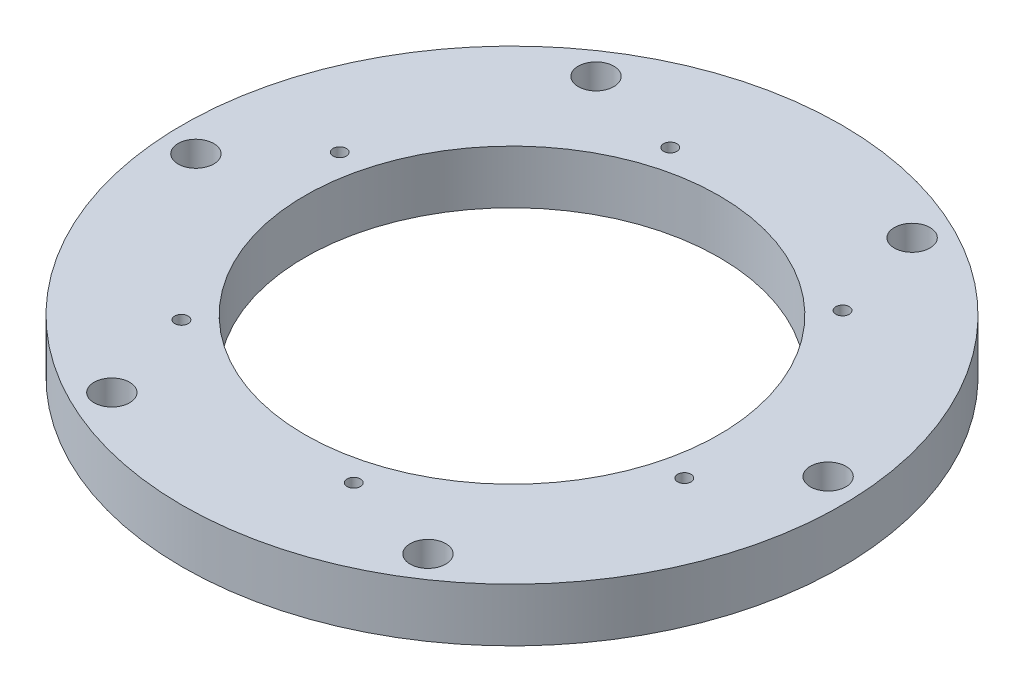
ISO-10303-21;
HEADER;
FILE_DESCRIPTION(('STEP AP214'),'2;1');
FILE_NAME('part.step','',(''),(''),'','','');
FILE_SCHEMA(('AUTOMOTIVE_DESIGN { 1 0 10303 214 1 1 1 1 }'));
ENDSEC;
DATA;
#1=APPLICATION_CONTEXT('core data for automotive mechanical design processes');
#2=APPLICATION_PROTOCOL_DEFINITION('international standard','automotive_design',2000,#1);
#3=PRODUCT_CONTEXT('',#1,'mechanical');
#4=PRODUCT('Part','Part','',(#3));
#5=PRODUCT_RELATED_PRODUCT_CATEGORY('part','',(#4));
#6=PRODUCT_DEFINITION_FORMATION('','',#4);
#7=PRODUCT_DEFINITION_CONTEXT('part definition',#1,'design');
#8=PRODUCT_DEFINITION('design','',#6,#7);
#9=PRODUCT_DEFINITION_SHAPE('','',#8);
#10=(LENGTH_UNIT() NAMED_UNIT(*) SI_UNIT(.MILLI.,.METRE.));
#11=(NAMED_UNIT(*) PLANE_ANGLE_UNIT() SI_UNIT($,.RADIAN.));
#12=(NAMED_UNIT(*) SI_UNIT($,.STERADIAN.) SOLID_ANGLE_UNIT());
#13=UNCERTAINTY_MEASURE_WITH_UNIT(LENGTH_MEASURE(1.E-05),#10,'distance_accuracy_value','');
#14=(GEOMETRIC_REPRESENTATION_CONTEXT(3) GLOBAL_UNCERTAINTY_ASSIGNED_CONTEXT((#13)) GLOBAL_UNIT_ASSIGNED_CONTEXT((#10,
#11,#12)) REPRESENTATION_CONTEXT('',''));
#15=CARTESIAN_POINT('',(0.,0.,0.));
#16=DIRECTION('',(0.,0.,1.));
#17=DIRECTION('',(1.,0.,0.));
#18=AXIS2_PLACEMENT_3D('',#15,#16,#17);
#19=CARTESIAN_POINT('',(0.,12.,0.));
#20=DIRECTION('',(0.,1.,0.));
#21=DIRECTION('',(0.,0.,1.));
#22=AXIS2_PLACEMENT_3D('',#19,#20,#21);
#23=PLANE('',#22);
#24=CARTESIAN_POINT('',(-14.829977420968,12.,-50.3619079234818));
#25=DIRECTION('',(0.,1.,0.));
#26=DIRECTION('',(0.,0.,1.));
#27=AXIS2_PLACEMENT_3D('',#24,#25,#26);
#28=CIRCLE('',#27,1.50000000000354);
#29=CARTESIAN_POINT('',(-14.829977420968,12.,-48.8619079234782));
#30=VERTEX_POINT('',#29);
#31=EDGE_CURVE('E115',#30,#30,#28,.T.);
#32=ORIENTED_EDGE('',*,*,#31,.F.);
#33=EDGE_LOOP('',(#32));
#34=FACE_BOUND('',#33,.T.);
#35=CARTESIAN_POINT('',(-51.0296803552723,12.,-12.3378167776296));
#36=DIRECTION('',(0.,1.,0.));
#37=DIRECTION('',(0.,0.,1.));
#38=AXIS2_PLACEMENT_3D('',#35,#36,#37);
#39=CIRCLE('',#38,1.50000000000555);
#40=CARTESIAN_POINT('',(-51.0296803552723,12.,-10.8378167776241));
#41=VERTEX_POINT('',#40);
#42=EDGE_CURVE('E103',#41,#41,#39,.T.);
#43=ORIENTED_EDGE('',*,*,#42,.F.);
#44=EDGE_LOOP('',(#43));
#45=FACE_BOUND('',#44,.T.);
#46=CARTESIAN_POINT('',(-36.1997029343015,12.,38.024091145854));
#47=DIRECTION('',(0.,1.,0.));
#48=DIRECTION('',(0.,0.,1.));
#49=AXIS2_PLACEMENT_3D('',#46,#47,#48);
#50=CIRCLE('',#49,1.50000000000428);
#51=CARTESIAN_POINT('',(-36.1997029343015,12.,39.5240911458582));
#52=VERTEX_POINT('',#51);
#53=EDGE_CURVE('E91',#52,#52,#50,.T.);
#54=ORIENTED_EDGE('',*,*,#53,.F.);
#55=EDGE_LOOP('',(#54));
#56=FACE_BOUND('',#55,.T.);
#57=CARTESIAN_POINT('',(14.8299774209735,12.,50.3619079234855));
#58=DIRECTION('',(0.,1.,0.));
#59=DIRECTION('',(0.,0.,1.));
#60=AXIS2_PLACEMENT_3D('',#57,#58,#59);
#61=CIRCLE('',#60,1.500000000001);
#62=CARTESIAN_POINT('',(14.8299774209735,12.,51.8619079234865));
#63=VERTEX_POINT('',#62);
#64=EDGE_CURVE('E79',#63,#63,#61,.T.);
#65=ORIENTED_EDGE('',*,*,#64,.F.);
#66=EDGE_LOOP('',(#65));
#67=FACE_BOUND('',#66,.T.);
#68=CARTESIAN_POINT('',(51.0296803552777,12.,12.3378167776334));
#69=DIRECTION('',(0.,1.,0.));
#70=DIRECTION('',(0.,0.,1.));
#71=AXIS2_PLACEMENT_3D('',#68,#69,#70);
#72=CIRCLE('',#71,1.49999999999886);
#73=CARTESIAN_POINT('',(51.0296803552777,12.,13.8378167776322));
#74=VERTEX_POINT('',#73);
#75=EDGE_CURVE('E67',#74,#74,#72,.T.);
#76=ORIENTED_EDGE('',*,*,#75,.F.);
#77=EDGE_LOOP('',(#76));
#78=FACE_BOUND('',#77,.T.);
#79=CARTESIAN_POINT('',(36.199702934307,12.,-38.0240911458502));
#80=DIRECTION('',(0.,1.,0.));
#81=DIRECTION('',(0.,0.,1.));
#82=AXIS2_PLACEMENT_3D('',#79,#80,#81);
#83=CIRCLE('',#82,1.5);
#84=CARTESIAN_POINT('',(36.199702934307,12.,-36.5240911458502));
#85=VERTEX_POINT('',#84);
#86=EDGE_CURVE('E55',#85,#85,#83,.T.);
#87=ORIENTED_EDGE('',*,*,#86,.F.);
#88=EDGE_LOOP('',(#87));
#89=FACE_BOUND('',#88,.T.);
#90=CARTESIAN_POINT('',(0.,12.,0.));
#91=DIRECTION('',(0.,1.,0.));
#92=DIRECTION('',(0.,0.,1.));
#93=AXIS2_PLACEMENT_3D('',#90,#91,#92);
#94=CIRCLE('',#93,74.);
#95=CARTESIAN_POINT('',(0.,12.,74.));
#96=VERTEX_POINT('',#95);
#97=EDGE_CURVE('E10',#96,#96,#94,.T.);
#98=ORIENTED_EDGE('',*,*,#97,.T.);
#99=EDGE_LOOP('',(#98));
#100=FACE_BOUND('',#99,.T.);
#101=CARTESIAN_POINT('',(0.,12.,0.));
#102=DIRECTION('',(0.,1.,0.));
#103=DIRECTION('',(0.,0.,1.));
#104=AXIS2_PLACEMENT_3D('',#101,#102,#103);
#105=CIRCLE('',#104,46.5);
#106=CARTESIAN_POINT('',(0.,12.,46.5));
#107=VERTEX_POINT('',#106);
#108=EDGE_CURVE('E50',#107,#107,#105,.T.);
#109=ORIENTED_EDGE('',*,*,#108,.F.);
#110=EDGE_LOOP('',(#109));
#111=FACE_BOUND('',#110,.T.);
#112=CARTESIAN_POINT('',(29.8814160452311,12.,-59.9674993236487));
#113=DIRECTION('',(0.,1.,0.));
#114=DIRECTION('',(0.,0.,1.));
#115=AXIS2_PLACEMENT_3D('',#112,#113,#114);
#116=CIRCLE('',#115,4.00000000000001);
#117=CARTESIAN_POINT('',(29.8814160452311,12.,-55.9674993236487));
#118=VERTEX_POINT('',#117);
#119=EDGE_CURVE('E61',#118,#118,#116,.T.);
#120=ORIENTED_EDGE('',*,*,#119,.F.);
#121=EDGE_LOOP('',(#120));
#122=FACE_BOUND('',#121,.T.);
#123=CARTESIAN_POINT('',(66.8740858383244,12.,-4.1056842656037));
#124=DIRECTION('',(0.,1.,0.));
#125=DIRECTION('',(0.,0.,1.));
#126=AXIS2_PLACEMENT_3D('',#123,#124,#125);
#127=CIRCLE('',#126,3.99999999999893);
#128=CARTESIAN_POINT('',(66.8740858383244,12.,-0.105684265604762));
#129=VERTEX_POINT('',#128);
#130=EDGE_CURVE('E73',#129,#129,#127,.T.);
#131=ORIENTED_EDGE('',*,*,#130,.F.);
#132=EDGE_LOOP('',(#131));
#133=FACE_BOUND('',#132,.T.);
#134=CARTESIAN_POINT('',(36.992669793096,12.,55.8618150580468));
#135=DIRECTION('',(0.,1.,0.));
#136=DIRECTION('',(0.,0.,1.));
#137=AXIS2_PLACEMENT_3D('',#134,#135,#136);
#138=CIRCLE('',#137,4.00000000000111);
#139=CARTESIAN_POINT('',(36.992669793096,12.,59.861815058048));
#140=VERTEX_POINT('',#139);
#141=EDGE_CURVE('E85',#140,#140,#138,.T.);
#142=ORIENTED_EDGE('',*,*,#141,.F.);
#143=EDGE_LOOP('',(#142));
#144=FACE_BOUND('',#143,.T.);
#145=CARTESIAN_POINT('',(-29.8814160452257,12.,59.9674993236524));
#146=DIRECTION('',(0.,1.,0.));
#147=DIRECTION('',(0.,0.,1.));
#148=AXIS2_PLACEMENT_3D('',#145,#146,#147);
#149=CIRCLE('',#148,4.00000000000445);
#150=CARTESIAN_POINT('',(-29.8814160452257,12.,63.9674993236568));
#151=VERTEX_POINT('',#150);
#152=EDGE_CURVE('E97',#151,#151,#149,.T.);
#153=ORIENTED_EDGE('',*,*,#152,.F.);
#154=EDGE_LOOP('',(#153));
#155=FACE_BOUND('',#154,.T.);
#156=CARTESIAN_POINT('',(-66.874085838319,12.,4.10568426560743));
#157=DIRECTION('',(0.,1.,0.));
#158=DIRECTION('',(0.,0.,1.));
#159=AXIS2_PLACEMENT_3D('',#156,#157,#158);
#160=CIRCLE('',#159,4.00000000000578);
#161=CARTESIAN_POINT('',(-66.874085838319,12.,8.1056842656132));
#162=VERTEX_POINT('',#161);
#163=EDGE_CURVE('E109',#162,#162,#160,.T.);
#164=ORIENTED_EDGE('',*,*,#163,.F.);
#165=EDGE_LOOP('',(#164));
#166=FACE_BOUND('',#165,.T.);
#167=CARTESIAN_POINT('',(-36.9926697930906,12.,-55.8618150580431));
#168=DIRECTION('',(0.,1.,0.));
#169=DIRECTION('',(0.,0.,1.));
#170=AXIS2_PLACEMENT_3D('',#167,#168,#169);
#171=CIRCLE('',#170,4.00000000000381);
#172=CARTESIAN_POINT('',(-36.9926697930906,12.,-51.8618150580393));
#173=VERTEX_POINT('',#172);
#174=EDGE_CURVE('E121',#173,#173,#171,.T.);
#175=ORIENTED_EDGE('',*,*,#174,.F.);
#176=EDGE_LOOP('',(#175));
#177=FACE_BOUND('',#176,.T.);
#178=ADVANCED_FACE('F39',(#34,#45,#56,#67,#78,#89,#100,#111,#122,#133,#144,#155,#166,#177),#23,.T.);
#179=CARTESIAN_POINT('',(0.,0.,0.));
#180=DIRECTION('',(0.,1.,0.));
#181=DIRECTION('',(0.,0.,1.));
#182=AXIS2_PLACEMENT_3D('',#179,#180,#181);
#183=PLANE('',#182);
#184=CARTESIAN_POINT('',(0.,0.,0.));
#185=DIRECTION('',(0.,1.,0.));
#186=DIRECTION('',(0.,0.,1.));
#187=AXIS2_PLACEMENT_3D('',#184,#185,#186);
#188=CIRCLE('',#187,74.);
#189=CARTESIAN_POINT('',(0.,0.,74.));
#190=VERTEX_POINT('',#189);
#191=EDGE_CURVE('E43',#190,#190,#188,.T.);
#192=ORIENTED_EDGE('',*,*,#191,.F.);
#193=EDGE_LOOP('',(#192));
#194=FACE_BOUND('',#193,.T.);
#195=CARTESIAN_POINT('',(0.,0.,0.));
#196=DIRECTION('',(0.,1.,0.));
#197=DIRECTION('',(0.,0.,1.));
#198=AXIS2_PLACEMENT_3D('',#195,#196,#197);
#199=CIRCLE('',#198,46.5);
#200=CARTESIAN_POINT('',(0.,0.,46.5));
#201=VERTEX_POINT('',#200);
#202=EDGE_CURVE('E52',#201,#201,#199,.T.);
#203=ORIENTED_EDGE('',*,*,#202,.T.);
#204=EDGE_LOOP('',(#203));
#205=FACE_BOUND('',#204,.T.);
#206=CARTESIAN_POINT('',(36.199702934307,0.,-38.0240911458502));
#207=DIRECTION('',(0.,1.,0.));
#208=DIRECTION('',(0.,0.,1.));
#209=AXIS2_PLACEMENT_3D('',#206,#207,#208);
#210=CIRCLE('',#209,1.5);
#211=CARTESIAN_POINT('',(36.199702934307,0.,-36.5240911458502));
#212=VERTEX_POINT('',#211);
#213=EDGE_CURVE('E58',#212,#212,#210,.T.);
#214=ORIENTED_EDGE('',*,*,#213,.T.);
#215=EDGE_LOOP('',(#214));
#216=FACE_BOUND('',#215,.T.);
#217=CARTESIAN_POINT('',(29.8814160452311,0.,-59.9674993236487));
#218=DIRECTION('',(0.,1.,0.));
#219=DIRECTION('',(0.,0.,1.));
#220=AXIS2_PLACEMENT_3D('',#217,#218,#219);
#221=CIRCLE('',#220,4.00000000000001);
#222=CARTESIAN_POINT('',(29.8814160452311,0.,-55.9674993236487));
#223=VERTEX_POINT('',#222);
#224=EDGE_CURVE('E64',#223,#223,#221,.T.);
#225=ORIENTED_EDGE('',*,*,#224,.T.);
#226=EDGE_LOOP('',(#225));
#227=FACE_BOUND('',#226,.T.);
#228=CARTESIAN_POINT('',(51.0296803552777,0.,12.3378167776334));
#229=DIRECTION('',(0.,1.,0.));
#230=DIRECTION('',(0.,0.,1.));
#231=AXIS2_PLACEMENT_3D('',#228,#229,#230);
#232=CIRCLE('',#231,1.49999999999886);
#233=CARTESIAN_POINT('',(51.0296803552777,0.,13.8378167776322));
#234=VERTEX_POINT('',#233);
#235=EDGE_CURVE('E70',#234,#234,#232,.T.);
#236=ORIENTED_EDGE('',*,*,#235,.T.);
#237=EDGE_LOOP('',(#236));
#238=FACE_BOUND('',#237,.T.);
#239=CARTESIAN_POINT('',(66.8740858383244,0.,-4.1056842656037));
#240=DIRECTION('',(0.,1.,0.));
#241=DIRECTION('',(0.,0.,1.));
#242=AXIS2_PLACEMENT_3D('',#239,#240,#241);
#243=CIRCLE('',#242,3.99999999999893);
#244=CARTESIAN_POINT('',(66.8740858383244,0.,-0.105684265604762));
#245=VERTEX_POINT('',#244);
#246=EDGE_CURVE('E76',#245,#245,#243,.T.);
#247=ORIENTED_EDGE('',*,*,#246,.T.);
#248=EDGE_LOOP('',(#247));
#249=FACE_BOUND('',#248,.T.);
#250=CARTESIAN_POINT('',(14.8299774209735,0.,50.3619079234855));
#251=DIRECTION('',(0.,1.,0.));
#252=DIRECTION('',(0.,0.,1.));
#253=AXIS2_PLACEMENT_3D('',#250,#251,#252);
#254=CIRCLE('',#253,1.500000000001);
#255=CARTESIAN_POINT('',(14.8299774209735,0.,51.8619079234865));
#256=VERTEX_POINT('',#255);
#257=EDGE_CURVE('E82',#256,#256,#254,.T.);
#258=ORIENTED_EDGE('',*,*,#257,.T.);
#259=EDGE_LOOP('',(#258));
#260=FACE_BOUND('',#259,.T.);
#261=CARTESIAN_POINT('',(36.992669793096,0.,55.8618150580468));
#262=DIRECTION('',(0.,1.,0.));
#263=DIRECTION('',(0.,0.,1.));
#264=AXIS2_PLACEMENT_3D('',#261,#262,#263);
#265=CIRCLE('',#264,4.00000000000111);
#266=CARTESIAN_POINT('',(36.992669793096,0.,59.861815058048));
#267=VERTEX_POINT('',#266);
#268=EDGE_CURVE('E88',#267,#267,#265,.T.);
#269=ORIENTED_EDGE('',*,*,#268,.T.);
#270=EDGE_LOOP('',(#269));
#271=FACE_BOUND('',#270,.T.);
#272=CARTESIAN_POINT('',(-36.1997029343015,0.,38.024091145854));
#273=DIRECTION('',(0.,1.,0.));
#274=DIRECTION('',(0.,0.,1.));
#275=AXIS2_PLACEMENT_3D('',#272,#273,#274);
#276=CIRCLE('',#275,1.50000000000428);
#277=CARTESIAN_POINT('',(-36.1997029343015,0.,39.5240911458582));
#278=VERTEX_POINT('',#277);
#279=EDGE_CURVE('E94',#278,#278,#276,.T.);
#280=ORIENTED_EDGE('',*,*,#279,.T.);
#281=EDGE_LOOP('',(#280));
#282=FACE_BOUND('',#281,.T.);
#283=CARTESIAN_POINT('',(-29.8814160452257,0.,59.9674993236524));
#284=DIRECTION('',(0.,1.,0.));
#285=DIRECTION('',(0.,0.,1.));
#286=AXIS2_PLACEMENT_3D('',#283,#284,#285);
#287=CIRCLE('',#286,4.00000000000445);
#288=CARTESIAN_POINT('',(-29.8814160452257,0.,63.9674993236568));
#289=VERTEX_POINT('',#288);
#290=EDGE_CURVE('E100',#289,#289,#287,.T.);
#291=ORIENTED_EDGE('',*,*,#290,.T.);
#292=EDGE_LOOP('',(#291));
#293=FACE_BOUND('',#292,.T.);
#294=CARTESIAN_POINT('',(-51.0296803552723,0.,-12.3378167776296));
#295=DIRECTION('',(0.,1.,0.));
#296=DIRECTION('',(0.,0.,1.));
#297=AXIS2_PLACEMENT_3D('',#294,#295,#296);
#298=CIRCLE('',#297,1.50000000000555);
#299=CARTESIAN_POINT('',(-51.0296803552723,0.,-10.8378167776241));
#300=VERTEX_POINT('',#299);
#301=EDGE_CURVE('E106',#300,#300,#298,.T.);
#302=ORIENTED_EDGE('',*,*,#301,.T.);
#303=EDGE_LOOP('',(#302));
#304=FACE_BOUND('',#303,.T.);
#305=CARTESIAN_POINT('',(-66.874085838319,0.,4.10568426560743));
#306=DIRECTION('',(0.,1.,0.));
#307=DIRECTION('',(0.,0.,1.));
#308=AXIS2_PLACEMENT_3D('',#305,#306,#307);
#309=CIRCLE('',#308,4.00000000000578);
#310=CARTESIAN_POINT('',(-66.874085838319,0.,8.1056842656132));
#311=VERTEX_POINT('',#310);
#312=EDGE_CURVE('E112',#311,#311,#309,.T.);
#313=ORIENTED_EDGE('',*,*,#312,.T.);
#314=EDGE_LOOP('',(#313));
#315=FACE_BOUND('',#314,.T.);
#316=CARTESIAN_POINT('',(-14.829977420968,0.,-50.3619079234818));
#317=DIRECTION('',(0.,1.,0.));
#318=DIRECTION('',(0.,0.,1.));
#319=AXIS2_PLACEMENT_3D('',#316,#317,#318);
#320=CIRCLE('',#319,1.50000000000354);
#321=CARTESIAN_POINT('',(-14.829977420968,0.,-48.8619079234782));
#322=VERTEX_POINT('',#321);
#323=EDGE_CURVE('E118',#322,#322,#320,.T.);
#324=ORIENTED_EDGE('',*,*,#323,.T.);
#325=EDGE_LOOP('',(#324));
#326=FACE_BOUND('',#325,.T.);
#327=CARTESIAN_POINT('',(-36.9926697930906,0.,-55.8618150580431));
#328=DIRECTION('',(0.,1.,0.));
#329=DIRECTION('',(0.,0.,1.));
#330=AXIS2_PLACEMENT_3D('',#327,#328,#329);
#331=CIRCLE('',#330,4.00000000000381);
#332=CARTESIAN_POINT('',(-36.9926697930906,0.,-51.8618150580393));
#333=VERTEX_POINT('',#332);
#334=EDGE_CURVE('E124',#333,#333,#331,.T.);
#335=ORIENTED_EDGE('',*,*,#334,.T.);
#336=EDGE_LOOP('',(#335));
#337=FACE_BOUND('',#336,.T.);
#338=ADVANCED_FACE('F134',(#194,#205,#216,#227,#238,#249,#260,#271,#282,#293,#304,#315,#326,
#337),#183,.F.);
#339=CARTESIAN_POINT('',(0.,12.,0.));
#340=DIRECTION('',(0.,-1.,0.));
#341=DIRECTION('',(0.,0.,-1.));
#342=AXIS2_PLACEMENT_3D('',#339,#340,#341);
#343=CYLINDRICAL_SURFACE('',#342,74.);
#344=ORIENTED_EDGE('',*,*,#97,.F.);
#345=EDGE_LOOP('',(#344));
#346=FACE_BOUND('',#345,.T.);
#347=ORIENTED_EDGE('',*,*,#191,.T.);
#348=EDGE_LOOP('',(#347));
#349=FACE_BOUND('',#348,.T.);
#350=ADVANCED_FACE('F41',(#346,#349),#343,.T.);
#351=CARTESIAN_POINT('',(0.,12.,0.));
#352=DIRECTION('',(0.,-1.,0.));
#353=DIRECTION('',(0.,0.,-1.));
#354=AXIS2_PLACEMENT_3D('',#351,#352,#353);
#355=CYLINDRICAL_SURFACE('',#354,46.5);
#356=ORIENTED_EDGE('',*,*,#108,.T.);
#357=EDGE_LOOP('',(#356));
#358=FACE_BOUND('',#357,.T.);
#359=ORIENTED_EDGE('',*,*,#202,.F.);
#360=EDGE_LOOP('',(#359));
#361=FACE_BOUND('',#360,.T.);
#362=ADVANCED_FACE('F144',(#358,#361),#355,.F.);
#363=CARTESIAN_POINT('',(36.199702934307,12.,-38.0240911458502));
#364=DIRECTION('',(0.,-1.,0.));
#365=DIRECTION('',(0.,0.,-1.));
#366=AXIS2_PLACEMENT_3D('',#363,#364,#365);
#367=CYLINDRICAL_SURFACE('',#366,1.5);
#368=ORIENTED_EDGE('',*,*,#86,.T.);
#369=EDGE_LOOP('',(#368));
#370=FACE_BOUND('',#369,.T.);
#371=ORIENTED_EDGE('',*,*,#213,.F.);
#372=EDGE_LOOP('',(#371));
#373=FACE_BOUND('',#372,.T.);
#374=ADVANCED_FACE('F147',(#370,#373),#367,.F.);
#375=CARTESIAN_POINT('',(29.8814160452311,12.,-59.9674993236487));
#376=DIRECTION('',(0.,-1.,0.));
#377=DIRECTION('',(0.,0.,-1.));
#378=AXIS2_PLACEMENT_3D('',#375,#376,#377);
#379=CYLINDRICAL_SURFACE('',#378,4.00000000000001);
#380=ORIENTED_EDGE('',*,*,#119,.T.);
#381=EDGE_LOOP('',(#380));
#382=FACE_BOUND('',#381,.T.);
#383=ORIENTED_EDGE('',*,*,#224,.F.);
#384=EDGE_LOOP('',(#383));
#385=FACE_BOUND('',#384,.T.);
#386=ADVANCED_FACE('F151',(#382,#385),#379,.F.);
#387=CARTESIAN_POINT('',(51.0296803552777,12.,12.3378167776334));
#388=DIRECTION('',(0.,-1.,0.));
#389=DIRECTION('',(0.,0.,-1.));
#390=AXIS2_PLACEMENT_3D('',#387,#388,#389);
#391=CYLINDRICAL_SURFACE('',#390,1.49999999999886);
#392=ORIENTED_EDGE('',*,*,#75,.T.);
#393=EDGE_LOOP('',(#392));
#394=FACE_BOUND('',#393,.T.);
#395=ORIENTED_EDGE('',*,*,#235,.F.);
#396=EDGE_LOOP('',(#395));
#397=FACE_BOUND('',#396,.T.);
#398=ADVANCED_FACE('F155',(#394,#397),#391,.F.);
#399=CARTESIAN_POINT('',(66.8740858383244,12.,-4.1056842656037));
#400=DIRECTION('',(0.,-1.,0.));
#401=DIRECTION('',(0.,0.,-1.));
#402=AXIS2_PLACEMENT_3D('',#399,#400,#401);
#403=CYLINDRICAL_SURFACE('',#402,3.99999999999893);
#404=ORIENTED_EDGE('',*,*,#130,.T.);
#405=EDGE_LOOP('',(#404));
#406=FACE_BOUND('',#405,.T.);
#407=ORIENTED_EDGE('',*,*,#246,.F.);
#408=EDGE_LOOP('',(#407));
#409=FACE_BOUND('',#408,.T.);
#410=ADVANCED_FACE('F159',(#406,#409),#403,.F.);
#411=CARTESIAN_POINT('',(14.8299774209735,12.,50.3619079234855));
#412=DIRECTION('',(0.,-1.,0.));
#413=DIRECTION('',(0.,0.,-1.));
#414=AXIS2_PLACEMENT_3D('',#411,#412,#413);
#415=CYLINDRICAL_SURFACE('',#414,1.500000000001);
#416=ORIENTED_EDGE('',*,*,#64,.T.);
#417=EDGE_LOOP('',(#416));
#418=FACE_BOUND('',#417,.T.);
#419=ORIENTED_EDGE('',*,*,#257,.F.);
#420=EDGE_LOOP('',(#419));
#421=FACE_BOUND('',#420,.T.);
#422=ADVANCED_FACE('F163',(#418,#421),#415,.F.);
#423=CARTESIAN_POINT('',(36.992669793096,12.,55.8618150580468));
#424=DIRECTION('',(0.,-1.,0.));
#425=DIRECTION('',(0.,0.,-1.));
#426=AXIS2_PLACEMENT_3D('',#423,#424,#425);
#427=CYLINDRICAL_SURFACE('',#426,4.00000000000111);
#428=ORIENTED_EDGE('',*,*,#141,.T.);
#429=EDGE_LOOP('',(#428));
#430=FACE_BOUND('',#429,.T.);
#431=ORIENTED_EDGE('',*,*,#268,.F.);
#432=EDGE_LOOP('',(#431));
#433=FACE_BOUND('',#432,.T.);
#434=ADVANCED_FACE('F167',(#430,#433),#427,.F.);
#435=CARTESIAN_POINT('',(-36.1997029343015,12.,38.024091145854));
#436=DIRECTION('',(0.,-1.,0.));
#437=DIRECTION('',(0.,0.,-1.));
#438=AXIS2_PLACEMENT_3D('',#435,#436,#437);
#439=CYLINDRICAL_SURFACE('',#438,1.50000000000428);
#440=ORIENTED_EDGE('',*,*,#53,.T.);
#441=EDGE_LOOP('',(#440));
#442=FACE_BOUND('',#441,.T.);
#443=ORIENTED_EDGE('',*,*,#279,.F.);
#444=EDGE_LOOP('',(#443));
#445=FACE_BOUND('',#444,.T.);
#446=ADVANCED_FACE('F171',(#442,#445),#439,.F.);
#447=CARTESIAN_POINT('',(-29.8814160452257,12.,59.9674993236524));
#448=DIRECTION('',(0.,-1.,0.));
#449=DIRECTION('',(0.,0.,-1.));
#450=AXIS2_PLACEMENT_3D('',#447,#448,#449);
#451=CYLINDRICAL_SURFACE('',#450,4.00000000000445);
#452=ORIENTED_EDGE('',*,*,#152,.T.);
#453=EDGE_LOOP('',(#452));
#454=FACE_BOUND('',#453,.T.);
#455=ORIENTED_EDGE('',*,*,#290,.F.);
#456=EDGE_LOOP('',(#455));
#457=FACE_BOUND('',#456,.T.);
#458=ADVANCED_FACE('F175',(#454,#457),#451,.F.);
#459=CARTESIAN_POINT('',(-51.0296803552723,12.,-12.3378167776296));
#460=DIRECTION('',(0.,-1.,0.));
#461=DIRECTION('',(0.,0.,-1.));
#462=AXIS2_PLACEMENT_3D('',#459,#460,#461);
#463=CYLINDRICAL_SURFACE('',#462,1.50000000000555);
#464=ORIENTED_EDGE('',*,*,#42,.T.);
#465=EDGE_LOOP('',(#464));
#466=FACE_BOUND('',#465,.T.);
#467=ORIENTED_EDGE('',*,*,#301,.F.);
#468=EDGE_LOOP('',(#467));
#469=FACE_BOUND('',#468,.T.);
#470=ADVANCED_FACE('F179',(#466,#469),#463,.F.);
#471=CARTESIAN_POINT('',(-66.874085838319,12.,4.10568426560743));
#472=DIRECTION('',(0.,-1.,0.));
#473=DIRECTION('',(0.,0.,-1.));
#474=AXIS2_PLACEMENT_3D('',#471,#472,#473);
#475=CYLINDRICAL_SURFACE('',#474,4.00000000000578);
#476=ORIENTED_EDGE('',*,*,#163,.T.);
#477=EDGE_LOOP('',(#476));
#478=FACE_BOUND('',#477,.T.);
#479=ORIENTED_EDGE('',*,*,#312,.F.);
#480=EDGE_LOOP('',(#479));
#481=FACE_BOUND('',#480,.T.);
#482=ADVANCED_FACE('F183',(#478,#481),#475,.F.);
#483=CARTESIAN_POINT('',(-14.829977420968,12.,-50.3619079234818));
#484=DIRECTION('',(0.,-1.,0.));
#485=DIRECTION('',(0.,0.,-1.));
#486=AXIS2_PLACEMENT_3D('',#483,#484,#485);
#487=CYLINDRICAL_SURFACE('',#486,1.50000000000354);
#488=ORIENTED_EDGE('',*,*,#31,.T.);
#489=EDGE_LOOP('',(#488));
#490=FACE_BOUND('',#489,.T.);
#491=ORIENTED_EDGE('',*,*,#323,.F.);
#492=EDGE_LOOP('',(#491));
#493=FACE_BOUND('',#492,.T.);
#494=ADVANCED_FACE('F187',(#490,#493),#487,.F.);
#495=CARTESIAN_POINT('',(-36.9926697930906,12.,-55.8618150580431));
#496=DIRECTION('',(0.,-1.,0.));
#497=DIRECTION('',(0.,0.,-1.));
#498=AXIS2_PLACEMENT_3D('',#495,#496,#497);
#499=CYLINDRICAL_SURFACE('',#498,4.00000000000381);
#500=ORIENTED_EDGE('',*,*,#174,.T.);
#501=EDGE_LOOP('',(#500));
#502=FACE_BOUND('',#501,.T.);
#503=ORIENTED_EDGE('',*,*,#334,.F.);
#504=EDGE_LOOP('',(#503));
#505=FACE_BOUND('',#504,.T.);
#506=ADVANCED_FACE('F130',(#502,#505),#499,.F.);
#507=CLOSED_SHELL('',(#178,#338,#350,#362,#374,#386,#398,#410,#422,#434,#446,#458,#470,#482,
#494,#506));
#508=MANIFOLD_SOLID_BREP('B2',#507);
#509=ADVANCED_BREP_SHAPE_REPRESENTATION('',(#18,#508),#14);
#510=SHAPE_DEFINITION_REPRESENTATION(#9,#509);
ENDSEC;
END-ISO-10303-21;
